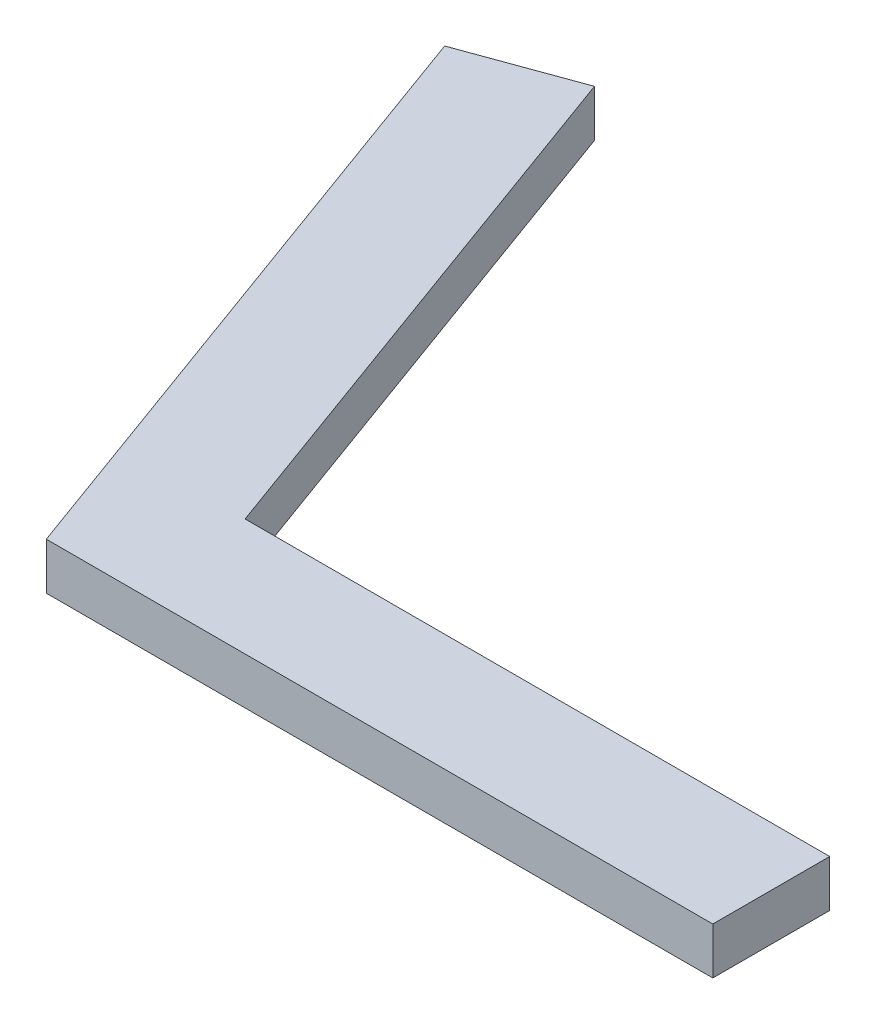
ISO-10303-21;
HEADER;
FILE_DESCRIPTION(('STEP AP214'),'2;1');
FILE_NAME('part.step','',(''),(''),'','','');
FILE_SCHEMA(('AUTOMOTIVE_DESIGN { 1 0 10303 214 1 1 1 1 }'));
ENDSEC;
DATA;
#1=APPLICATION_CONTEXT('core data for automotive mechanical design processes');
#2=APPLICATION_PROTOCOL_DEFINITION('international standard','automotive_design',2000,#1);
#3=PRODUCT_CONTEXT('',#1,'mechanical');
#4=PRODUCT('Part','Part','',(#3));
#5=PRODUCT_RELATED_PRODUCT_CATEGORY('part','',(#4));
#6=PRODUCT_DEFINITION_FORMATION('','',#4);
#7=PRODUCT_DEFINITION_CONTEXT('part definition',#1,'design');
#8=PRODUCT_DEFINITION('design','',#6,#7);
#9=PRODUCT_DEFINITION_SHAPE('','',#8);
#10=(LENGTH_UNIT() NAMED_UNIT(*) SI_UNIT(.MILLI.,.METRE.));
#11=(NAMED_UNIT(*) PLANE_ANGLE_UNIT() SI_UNIT($,.RADIAN.));
#12=(NAMED_UNIT(*) SI_UNIT($,.STERADIAN.) SOLID_ANGLE_UNIT());
#13=UNCERTAINTY_MEASURE_WITH_UNIT(LENGTH_MEASURE(1.E-05),#10,'distance_accuracy_value','');
#14=(GEOMETRIC_REPRESENTATION_CONTEXT(3) GLOBAL_UNCERTAINTY_ASSIGNED_CONTEXT((#13)) GLOBAL_UNIT_ASSIGNED_CONTEXT((#10,
#11,#12)) REPRESENTATION_CONTEXT('',''));
#15=CARTESIAN_POINT('',(0.,0.,0.));
#16=DIRECTION('',(0.,0.,1.));
#17=DIRECTION('',(1.,0.,0.));
#18=AXIS2_PLACEMENT_3D('',#15,#16,#17);
#19=CARTESIAN_POINT('',(31.75,2.54,6.35));
#20=DIRECTION('',(-1.,0.,0.));
#21=DIRECTION('',(0.,0.,1.));
#22=AXIS2_PLACEMENT_3D('',#19,#20,#21);
#23=PLANE('',#22);
#24=DIRECTION('',(0.,0.,-1.));
#25=VECTOR('',#24,1.);
#26=CARTESIAN_POINT('',(31.75,0.,6.35));
#27=LINE('',#26,#25);
#28=CARTESIAN_POINT('',(31.75,0.,6.35));
#29=VERTEX_POINT('',#28);
#30=CARTESIAN_POINT('',(31.75,0.,0.));
#31=VERTEX_POINT('',#30);
#32=EDGE_CURVE('E119',#29,#31,#27,.T.);
#33=ORIENTED_EDGE('',*,*,#32,.T.);
#34=DIRECTION('',(0.,-1.,0.));
#35=VECTOR('',#34,1.);
#36=CARTESIAN_POINT('',(31.75,2.54,0.));
#37=LINE('',#36,#35);
#38=CARTESIAN_POINT('',(31.75,2.54,0.));
#39=VERTEX_POINT('',#38);
#40=EDGE_CURVE('E11',#39,#31,#37,.T.);
#41=ORIENTED_EDGE('',*,*,#40,.F.);
#42=DIRECTION('',(0.,0.,-1.));
#43=VECTOR('',#42,1.);
#44=CARTESIAN_POINT('',(31.75,2.54,6.35));
#45=LINE('',#44,#43);
#46=CARTESIAN_POINT('',(31.75,2.54,6.35));
#47=VERTEX_POINT('',#46);
#48=EDGE_CURVE('E129',#47,#39,#45,.T.);
#49=ORIENTED_EDGE('',*,*,#48,.F.);
#50=DIRECTION('',(0.,-1.,0.));
#51=VECTOR('',#50,1.);
#52=CARTESIAN_POINT('',(31.75,2.54,6.35));
#53=LINE('',#52,#51);
#54=EDGE_CURVE('E115',#47,#29,#53,.T.);
#55=ORIENTED_EDGE('',*,*,#54,.T.);
#56=EDGE_LOOP('',(#33,#41,#49,#55));
#57=FACE_BOUND('',#56,.T.);
#58=ADVANCED_FACE('F35',(#57),#23,.F.);
#59=CARTESIAN_POINT('',(31.75,2.54,0.));
#60=DIRECTION('',(0.,0.,1.));
#61=DIRECTION('',(1.,0.,0.));
#62=AXIS2_PLACEMENT_3D('',#59,#60,#61);
#63=PLANE('',#62);
#64=DIRECTION('',(-1.,0.,0.));
#65=VECTOR('',#64,1.);
#66=CARTESIAN_POINT('',(31.75,0.,0.));
#67=LINE('',#66,#65);
#68=CARTESIAN_POINT('',(0.,0.,0.));
#69=VERTEX_POINT('',#68);
#70=EDGE_CURVE('E122',#31,#69,#67,.T.);
#71=ORIENTED_EDGE('',*,*,#70,.T.);
#72=DIRECTION('',(0.,-1.,0.));
#73=VECTOR('',#72,1.);
#74=CARTESIAN_POINT('',(0.,2.54,0.));
#75=LINE('',#74,#73);
#76=CARTESIAN_POINT('',(0.,2.54,0.));
#77=VERTEX_POINT('',#76);
#78=EDGE_CURVE('E43',#77,#69,#75,.T.);
#79=ORIENTED_EDGE('',*,*,#78,.F.);
#80=DIRECTION('',(-1.,0.,0.));
#81=VECTOR('',#80,1.);
#82=CARTESIAN_POINT('',(31.75,2.54,0.));
#83=LINE('',#82,#81);
#84=EDGE_CURVE('E88',#39,#77,#83,.T.);
#85=ORIENTED_EDGE('',*,*,#84,.F.);
#86=ORIENTED_EDGE('',*,*,#40,.T.);
#87=EDGE_LOOP('',(#71,#79,#85,#86));
#88=FACE_BOUND('',#87,.T.);
#89=ADVANCED_FACE('F153',(#88),#63,.F.);
#90=CARTESIAN_POINT('',(0.,2.54,0.));
#91=DIRECTION('',(-0.939692620785909,0.,0.342020143325666));
#92=DIRECTION('',(0.342020143325666,0.,0.939692620785909));
#93=AXIS2_PLACEMENT_3D('',#90,#91,#92);
#94=PLANE('',#93);
#95=DIRECTION('',(-0.342020143325666,0.,-0.939692620785909));
#96=VECTOR('',#95,1.);
#97=CARTESIAN_POINT('',(0.,0.,0.));
#98=LINE('',#97,#96);
#99=CARTESIAN_POINT('',(-10.8591395505899,0.,-29.8352407099526));
#100=VERTEX_POINT('',#99);
#101=EDGE_CURVE('E124',#69,#100,#98,.T.);
#102=ORIENTED_EDGE('',*,*,#101,.T.);
#103=DIRECTION('',(0.,-1.,0.));
#104=VECTOR('',#103,1.);
#105=CARTESIAN_POINT('',(-10.8591395505899,2.54,-29.8352407099526));
#106=LINE('',#105,#104);
#107=CARTESIAN_POINT('',(-10.8591395505899,2.54,-29.8352407099526));
#108=VERTEX_POINT('',#107);
#109=EDGE_CURVE('E110',#108,#100,#106,.T.);
#110=ORIENTED_EDGE('',*,*,#109,.F.);
#111=DIRECTION('',(-0.342020143325666,0.,-0.939692620785909));
#112=VECTOR('',#111,1.);
#113=CARTESIAN_POINT('',(0.,2.54,0.));
#114=LINE('',#113,#112);
#115=EDGE_CURVE('E101',#77,#108,#114,.T.);
#116=ORIENTED_EDGE('',*,*,#115,.F.);
#117=ORIENTED_EDGE('',*,*,#78,.T.);
#118=EDGE_LOOP('',(#102,#110,#116,#117));
#119=FACE_BOUND('',#118,.T.);
#120=ADVANCED_FACE('F135',(#119),#94,.F.);
#121=CARTESIAN_POINT('',(-10.8591395505899,2.54,-29.8352407099526));
#122=DIRECTION('',(0.342020143325666,0.,0.939692620785909));
#123=DIRECTION('',(0.939692620785909,0.,-0.342020143325666));
#124=AXIS2_PLACEMENT_3D('',#121,#122,#123);
#125=PLANE('',#124);
#126=DIRECTION('',(-0.939692620785909,0.,0.342020143325666));
#127=VECTOR('',#126,1.);
#128=CARTESIAN_POINT('',(-10.8591395505899,0.,-29.8352407099526));
#129=LINE('',#128,#127);
#130=CARTESIAN_POINT('',(-16.8261876925804,0.,-27.6634127998346));
#131=VERTEX_POINT('',#130);
#132=EDGE_CURVE('E109',#100,#131,#129,.T.);
#133=ORIENTED_EDGE('',*,*,#132,.T.);
#134=DIRECTION('',(0.,-1.,0.));
#135=VECTOR('',#134,1.);
#136=CARTESIAN_POINT('',(-16.8261876925804,2.54,-27.6634127998346));
#137=LINE('',#136,#135);
#138=CARTESIAN_POINT('',(-16.8261876925804,2.54,-27.6634127998346));
#139=VERTEX_POINT('',#138);
#140=EDGE_CURVE('E106',#139,#131,#137,.T.);
#141=ORIENTED_EDGE('',*,*,#140,.F.);
#142=DIRECTION('',(-0.939692620785909,0.,0.342020143325666));
#143=VECTOR('',#142,1.);
#144=CARTESIAN_POINT('',(-10.8591395505899,2.54,-29.8352407099526));
#145=LINE('',#144,#143);
#146=EDGE_CURVE('E95',#108,#139,#145,.T.);
#147=ORIENTED_EDGE('',*,*,#146,.F.);
#148=ORIENTED_EDGE('',*,*,#109,.T.);
#149=EDGE_LOOP('',(#133,#141,#147,#148));
#150=FACE_BOUND('',#149,.T.);
#151=ADVANCED_FACE('F107',(#150),#125,.F.);
#152=CARTESIAN_POINT('',(-16.8261876925804,2.54,-27.6634127998346));
#153=DIRECTION('',(0.939692620785909,0.,-0.342020143325666));
#154=DIRECTION('',(-0.342020143325667,0.,-0.939692620785909));
#155=AXIS2_PLACEMENT_3D('',#152,#153,#154);
#156=PLANE('',#155);
#157=DIRECTION('',(0.342020143325667,0.,0.939692620785909));
#158=VECTOR('',#157,1.);
#159=CARTESIAN_POINT('',(-16.8261876925804,0.,-27.6634127998346));
#160=LINE('',#159,#158);
#161=CARTESIAN_POINT('',(-4.44631786763166,0.,6.35));
#162=VERTEX_POINT('',#161);
#163=EDGE_CURVE('E74',#131,#162,#160,.T.);
#164=ORIENTED_EDGE('',*,*,#163,.T.);
#165=DIRECTION('',(0.,-1.,0.));
#166=VECTOR('',#165,1.);
#167=CARTESIAN_POINT('',(-4.44631786763166,2.54,6.35));
#168=LINE('',#167,#166);
#169=CARTESIAN_POINT('',(-4.44631786763166,2.54,6.35));
#170=VERTEX_POINT('',#169);
#171=EDGE_CURVE('E111',#170,#162,#168,.T.);
#172=ORIENTED_EDGE('',*,*,#171,.F.);
#173=DIRECTION('',(0.342020143325667,0.,0.939692620785909));
#174=VECTOR('',#173,1.);
#175=CARTESIAN_POINT('',(-16.8261876925804,2.54,-27.6634127998346));
#176=LINE('',#175,#174);
#177=EDGE_CURVE('E99',#139,#170,#176,.T.);
#178=ORIENTED_EDGE('',*,*,#177,.F.);
#179=ORIENTED_EDGE('',*,*,#140,.T.);
#180=EDGE_LOOP('',(#164,#172,#178,#179));
#181=FACE_BOUND('',#180,.T.);
#182=ADVANCED_FACE('F113',(#181),#156,.F.);
#183=CARTESIAN_POINT('',(-4.44631786763166,2.54,6.35));
#184=DIRECTION('',(0.,0.,-1.));
#185=DIRECTION('',(-1.,0.,0.));
#186=AXIS2_PLACEMENT_3D('',#183,#184,#185);
#187=PLANE('',#186);
#188=DIRECTION('',(1.,0.,0.));
#189=VECTOR('',#188,1.);
#190=CARTESIAN_POINT('',(-4.44631786763166,0.,6.35));
#191=LINE('',#190,#189);
#192=EDGE_CURVE('E80',#162,#29,#191,.T.);
#193=ORIENTED_EDGE('',*,*,#192,.T.);
#194=ORIENTED_EDGE('',*,*,#54,.F.);
#195=DIRECTION('',(1.,0.,0.));
#196=VECTOR('',#195,1.);
#197=CARTESIAN_POINT('',(-4.44631786763166,2.54,6.35));
#198=LINE('',#197,#196);
#199=EDGE_CURVE('E51',#170,#47,#198,.T.);
#200=ORIENTED_EDGE('',*,*,#199,.F.);
#201=ORIENTED_EDGE('',*,*,#171,.T.);
#202=EDGE_LOOP('',(#193,#194,#200,#201));
#203=FACE_BOUND('',#202,.T.);
#204=ADVANCED_FACE('F142',(#203),#187,.F.);
#205=CARTESIAN_POINT('',(0.,2.54,0.));
#206=DIRECTION('',(0.,1.,0.));
#207=DIRECTION('',(0.,0.,1.));
#208=AXIS2_PLACEMENT_3D('',#205,#206,#207);
#209=PLANE('',#208);
#210=ORIENTED_EDGE('',*,*,#48,.T.);
#211=ORIENTED_EDGE('',*,*,#84,.T.);
#212=ORIENTED_EDGE('',*,*,#115,.T.);
#213=ORIENTED_EDGE('',*,*,#146,.T.);
#214=ORIENTED_EDGE('',*,*,#177,.T.);
#215=ORIENTED_EDGE('',*,*,#199,.T.);
#216=EDGE_LOOP('',(#210,#211,#212,#213,#214,#215));
#217=FACE_BOUND('',#216,.T.);
#218=ADVANCED_FACE('F97',(#217),#209,.T.);
#219=CARTESIAN_POINT('',(0.,0.,0.));
#220=DIRECTION('',(0.,1.,0.));
#221=DIRECTION('',(0.,0.,1.));
#222=AXIS2_PLACEMENT_3D('',#219,#220,#221);
#223=PLANE('',#222);
#224=ORIENTED_EDGE('',*,*,#32,.F.);
#225=ORIENTED_EDGE('',*,*,#192,.F.);
#226=ORIENTED_EDGE('',*,*,#163,.F.);
#227=ORIENTED_EDGE('',*,*,#132,.F.);
#228=ORIENTED_EDGE('',*,*,#101,.F.);
#229=ORIENTED_EDGE('',*,*,#70,.F.);
#230=EDGE_LOOP('',(#224,#225,#226,#227,#228,#229));
#231=FACE_BOUND('',#230,.T.);
#232=ADVANCED_FACE('F138',(#231),#223,.F.);
#233=CLOSED_SHELL('',(#58,#89,#120,#151,#182,#204,#218,#232));
#234=MANIFOLD_SOLID_BREP('B2',#233);
#235=ADVANCED_BREP_SHAPE_REPRESENTATION('',(#18,#234),#14);
#236=SHAPE_DEFINITION_REPRESENTATION(#9,#235);
ENDSEC;
END-ISO-10303-21;
